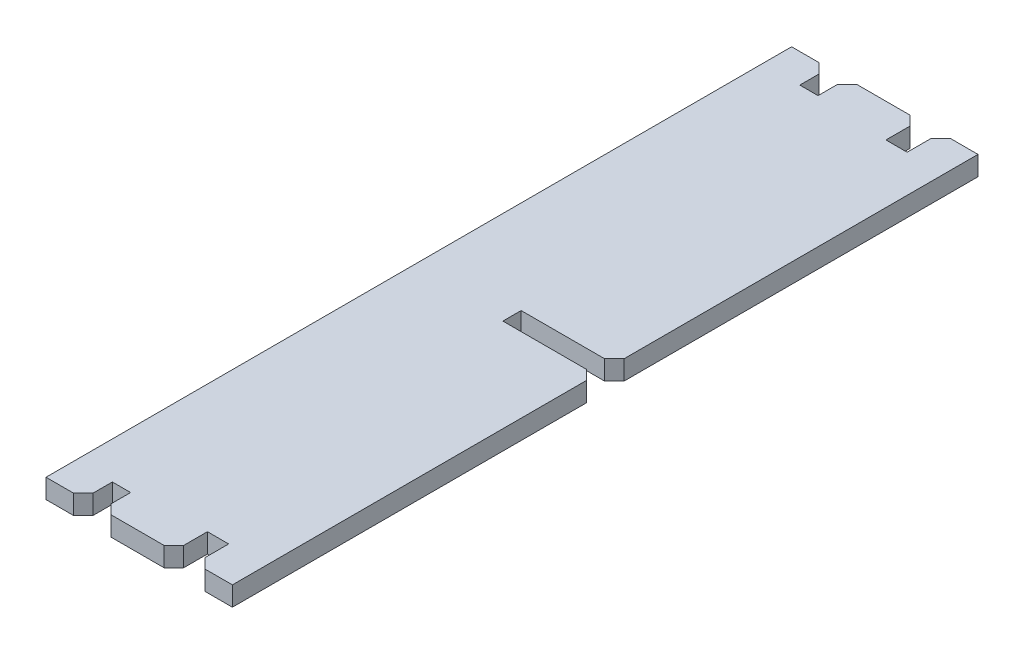
ISO-10303-21;
HEADER;
FILE_DESCRIPTION(('STEP AP214'),'2;1');
FILE_NAME('part.step','',(''),(''),'','','');
FILE_SCHEMA(('AUTOMOTIVE_DESIGN { 1 0 10303 214 1 1 1 1 }'));
ENDSEC;
DATA;
#1=APPLICATION_CONTEXT('core data for automotive mechanical design processes');
#2=APPLICATION_PROTOCOL_DEFINITION('international standard','automotive_design',2000,#1);
#3=PRODUCT_CONTEXT('',#1,'mechanical');
#4=PRODUCT('Part','Part','',(#3));
#5=PRODUCT_RELATED_PRODUCT_CATEGORY('part','',(#4));
#6=PRODUCT_DEFINITION_FORMATION('','',#4);
#7=PRODUCT_DEFINITION_CONTEXT('part definition',#1,'design');
#8=PRODUCT_DEFINITION('design','',#6,#7);
#9=PRODUCT_DEFINITION_SHAPE('','',#8);
#10=(LENGTH_UNIT() NAMED_UNIT(*) SI_UNIT(.MILLI.,.METRE.));
#11=(NAMED_UNIT(*) PLANE_ANGLE_UNIT() SI_UNIT($,.RADIAN.));
#12=(NAMED_UNIT(*) SI_UNIT($,.STERADIAN.) SOLID_ANGLE_UNIT());
#13=UNCERTAINTY_MEASURE_WITH_UNIT(LENGTH_MEASURE(1.E-05),#10,'distance_accuracy_value','');
#14=(GEOMETRIC_REPRESENTATION_CONTEXT(3) GLOBAL_UNCERTAINTY_ASSIGNED_CONTEXT((#13)) GLOBAL_UNIT_ASSIGNED_CONTEXT((#10,
#11,#12)) REPRESENTATION_CONTEXT('',''));
#15=CARTESIAN_POINT('',(0.,0.,0.));
#16=DIRECTION('',(0.,0.,1.));
#17=DIRECTION('',(1.,0.,0.));
#18=AXIS2_PLACEMENT_3D('',#15,#16,#17);
#19=CARTESIAN_POINT('',(0.,5.2,0.));
#20=DIRECTION('',(0.,0.,-1.));
#21=DIRECTION('',(-1.,0.,0.));
#22=AXIS2_PLACEMENT_3D('',#19,#20,#21);
#23=PLANE('',#22);
#24=DIRECTION('',(1.,0.,0.));
#25=VECTOR('',#24,1.);
#26=CARTESIAN_POINT('',(0.,0.,0.));
#27=LINE('',#26,#25);
#28=CARTESIAN_POINT('',(0.,0.,0.));
#29=VERTEX_POINT('',#28);
#30=CARTESIAN_POINT('',(7.40000000000001,0.,0.));
#31=VERTEX_POINT('',#30);
#32=EDGE_CURVE('E398',#29,#31,#27,.T.);
#33=ORIENTED_EDGE('',*,*,#32,.T.);
#34=DIRECTION('',(0.,1.,0.));
#35=VECTOR('',#34,1.);
#36=CARTESIAN_POINT('',(7.40000000000001,5.2,0.));
#37=LINE('',#36,#35);
#38=CARTESIAN_POINT('',(7.40000000000001,5.2,0.));
#39=VERTEX_POINT('',#38);
#40=EDGE_CURVE('E482',#31,#39,#37,.T.);
#41=ORIENTED_EDGE('',*,*,#40,.T.);
#42=DIRECTION('',(1.,0.,0.));
#43=VECTOR('',#42,1.);
#44=CARTESIAN_POINT('',(0.,5.2,0.));
#45=LINE('',#44,#43);
#46=CARTESIAN_POINT('',(0.,5.2,0.));
#47=VERTEX_POINT('',#46);
#48=EDGE_CURVE('E381',#47,#39,#45,.T.);
#49=ORIENTED_EDGE('',*,*,#48,.F.);
#50=DIRECTION('',(0.,-1.,0.));
#51=VECTOR('',#50,1.);
#52=CARTESIAN_POINT('',(0.,5.2,0.));
#53=LINE('',#52,#51);
#54=EDGE_CURVE('E418',#47,#29,#53,.T.);
#55=ORIENTED_EDGE('',*,*,#54,.T.);
#56=EDGE_LOOP('',(#33,#41,#49,#55));
#57=FACE_BOUND('',#56,.T.);
#58=ADVANCED_FACE('F35',(#57),#23,.F.);
#59=CARTESIAN_POINT('',(17.5,0.,0.));
#60=VERTEX_POINT('',#59);
#61=CARTESIAN_POINT('',(31.7,0.,0.));
#62=VERTEX_POINT('',#61);
#63=EDGE_CURVE('E402',#60,#62,#27,.T.);
#64=ORIENTED_EDGE('',*,*,#63,.T.);
#65=DIRECTION('',(0.,1.,0.));
#66=VECTOR('',#65,1.);
#67=CARTESIAN_POINT('',(31.7,5.2,0.));
#68=LINE('',#67,#66);
#69=CARTESIAN_POINT('',(31.7,5.2,0.));
#70=VERTEX_POINT('',#69);
#71=EDGE_CURVE('E472',#62,#70,#68,.T.);
#72=ORIENTED_EDGE('',*,*,#71,.T.);
#73=CARTESIAN_POINT('',(17.5,5.2,0.));
#74=VERTEX_POINT('',#73);
#75=EDGE_CURVE('E385',#74,#70,#45,.T.);
#76=ORIENTED_EDGE('',*,*,#75,.F.);
#77=DIRECTION('',(0.,-1.,0.));
#78=VECTOR('',#77,1.);
#79=CARTESIAN_POINT('',(17.5,5.2,0.));
#80=LINE('',#79,#78);
#81=EDGE_CURVE('E470',#74,#60,#80,.T.);
#82=ORIENTED_EDGE('',*,*,#81,.T.);
#83=EDGE_LOOP('',(#64,#72,#76,#82));
#84=FACE_BOUND('',#83,.T.);
#85=ADVANCED_FACE('F565',(#84),#23,.F.);
#86=CARTESIAN_POINT('',(50.,5.2,0.));
#87=DIRECTION('',(-1.,0.,0.));
#88=DIRECTION('',(0.,0.,1.));
#89=AXIS2_PLACEMENT_3D('',#86,#87,#88);
#90=PLANE('',#89);
#91=DIRECTION('',(0.,0.,-1.));
#92=VECTOR('',#91,1.);
#93=CARTESIAN_POINT('',(50.,0.,0.));
#94=LINE('',#93,#92);
#95=CARTESIAN_POINT('',(50.,0.,0.));
#96=VERTEX_POINT('',#95);
#97=CARTESIAN_POINT('',(50.,0.,-94.95));
#98=VERTEX_POINT('',#97);
#99=EDGE_CURVE('E403',#96,#98,#94,.T.);
#100=ORIENTED_EDGE('',*,*,#99,.T.);
#101=DIRECTION('',(0.,1.,0.));
#102=VECTOR('',#101,1.);
#103=CARTESIAN_POINT('',(50.,5.2,-94.95));
#104=LINE('',#103,#102);
#105=CARTESIAN_POINT('',(50.,5.2,-94.95));
#106=VERTEX_POINT('',#105);
#107=EDGE_CURVE('E490',#98,#106,#104,.T.);
#108=ORIENTED_EDGE('',*,*,#107,.T.);
#109=DIRECTION('',(0.,0.,-1.));
#110=VECTOR('',#109,1.);
#111=CARTESIAN_POINT('',(50.,5.2,0.));
#112=LINE('',#111,#110);
#113=CARTESIAN_POINT('',(50.,5.2,0.));
#114=VERTEX_POINT('',#113);
#115=EDGE_CURVE('E386',#114,#106,#112,.T.);
#116=ORIENTED_EDGE('',*,*,#115,.F.);
#117=DIRECTION('',(0.,-1.,0.));
#118=VECTOR('',#117,1.);
#119=CARTESIAN_POINT('',(50.,5.2,0.));
#120=LINE('',#119,#118);
#121=EDGE_CURVE('E415',#114,#96,#120,.T.);
#122=ORIENTED_EDGE('',*,*,#121,.T.);
#123=EDGE_LOOP('',(#100,#108,#116,#122));
#124=FACE_BOUND('',#123,.T.);
#125=ADVANCED_FACE('F587',(#124),#90,.F.);
#126=CARTESIAN_POINT('',(0.,5.2,-200.));
#127=DIRECTION('',(0.,0.,1.));
#128=DIRECTION('',(1.,0.,0.));
#129=AXIS2_PLACEMENT_3D('',#126,#127,#128);
#130=PLANE('',#129);
#131=DIRECTION('',(-1.,0.,0.));
#132=VECTOR('',#131,1.);
#133=CARTESIAN_POINT('',(0.,5.2,-200.));
#134=LINE('',#133,#132);
#135=CARTESIAN_POINT('',(31.7,5.2,-200.));
#136=VERTEX_POINT('',#135);
#137=CARTESIAN_POINT('',(17.5,5.2,-200.));
#138=VERTEX_POINT('',#137);
#139=EDGE_CURVE('E394',#136,#138,#134,.T.);
#140=ORIENTED_EDGE('',*,*,#139,.F.);
#141=DIRECTION('',(0.,-1.,0.));
#142=VECTOR('',#141,1.);
#143=CARTESIAN_POINT('',(31.7,5.2,-200.));
#144=LINE('',#143,#142);
#145=CARTESIAN_POINT('',(31.7,0.,-200.));
#146=VERTEX_POINT('',#145);
#147=EDGE_CURVE('E446',#136,#146,#144,.T.);
#148=ORIENTED_EDGE('',*,*,#147,.T.);
#149=DIRECTION('',(-1.,0.,0.));
#150=VECTOR('',#149,1.);
#151=CARTESIAN_POINT('',(0.,0.,-200.));
#152=LINE('',#151,#150);
#153=CARTESIAN_POINT('',(17.5,0.,-200.));
#154=VERTEX_POINT('',#153);
#155=EDGE_CURVE('E409',#146,#154,#152,.T.);
#156=ORIENTED_EDGE('',*,*,#155,.T.);
#157=DIRECTION('',(0.,1.,0.));
#158=VECTOR('',#157,1.);
#159=CARTESIAN_POINT('',(17.5,5.2,-200.));
#160=LINE('',#159,#158);
#161=EDGE_CURVE('E443',#154,#138,#160,.T.);
#162=ORIENTED_EDGE('',*,*,#161,.T.);
#163=EDGE_LOOP('',(#140,#148,#156,#162));
#164=FACE_BOUND('',#163,.T.);
#165=ADVANCED_FACE('F535',(#164),#130,.F.);
#166=CARTESIAN_POINT('',(7.39999999999996,5.2,-200.));
#167=VERTEX_POINT('',#166);
#168=CARTESIAN_POINT('',(0.,5.2,-200.));
#169=VERTEX_POINT('',#168);
#170=EDGE_CURVE('E389',#167,#169,#134,.T.);
#171=ORIENTED_EDGE('',*,*,#170,.F.);
#172=DIRECTION('',(0.,-1.,0.));
#173=VECTOR('',#172,1.);
#174=CARTESIAN_POINT('',(7.39999999999996,5.2,-200.));
#175=LINE('',#174,#173);
#176=CARTESIAN_POINT('',(7.39999999999996,0.,-200.));
#177=VERTEX_POINT('',#176);
#178=EDGE_CURVE('E44',#167,#177,#175,.T.);
#179=ORIENTED_EDGE('',*,*,#178,.T.);
#180=CARTESIAN_POINT('',(0.,0.,-200.));
#181=VERTEX_POINT('',#180);
#182=EDGE_CURVE('E406',#177,#181,#152,.T.);
#183=ORIENTED_EDGE('',*,*,#182,.T.);
#184=DIRECTION('',(0.,-1.,0.));
#185=VECTOR('',#184,1.);
#186=CARTESIAN_POINT('',(0.,5.2,-200.));
#187=LINE('',#186,#185);
#188=EDGE_CURVE('E393',#169,#181,#187,.T.);
#189=ORIENTED_EDGE('',*,*,#188,.F.);
#190=EDGE_LOOP('',(#171,#179,#183,#189));
#191=FACE_BOUND('',#190,.T.);
#192=ADVANCED_FACE('F506',(#191),#130,.F.);
#193=CARTESIAN_POINT('',(0.,5.2,0.));
#194=DIRECTION('',(1.,0.,0.));
#195=DIRECTION('',(0.,0.,-1.));
#196=AXIS2_PLACEMENT_3D('',#193,#194,#195);
#197=PLANE('',#196);
#198=DIRECTION('',(0.,0.,1.));
#199=VECTOR('',#198,1.);
#200=CARTESIAN_POINT('',(0.,0.,0.));
#201=LINE('',#200,#199);
#202=EDGE_CURVE('E373',#181,#29,#201,.T.);
#203=ORIENTED_EDGE('',*,*,#202,.T.);
#204=ORIENTED_EDGE('',*,*,#54,.F.);
#205=DIRECTION('',(0.,0.,1.));
#206=VECTOR('',#205,1.);
#207=CARTESIAN_POINT('',(0.,5.2,0.));
#208=LINE('',#207,#206);
#209=EDGE_CURVE('E376',#169,#47,#208,.T.);
#210=ORIENTED_EDGE('',*,*,#209,.F.);
#211=ORIENTED_EDGE('',*,*,#188,.T.);
#212=EDGE_LOOP('',(#203,#204,#210,#211));
#213=FACE_BOUND('',#212,.T.);
#214=ADVANCED_FACE('F540',(#213),#197,.F.);
#215=CARTESIAN_POINT('',(42.6,5.2,0.));
#216=VERTEX_POINT('',#215);
#217=EDGE_CURVE('E379',#216,#114,#45,.T.);
#218=ORIENTED_EDGE('',*,*,#217,.F.);
#219=DIRECTION('',(0.,-1.,0.));
#220=VECTOR('',#219,1.);
#221=CARTESIAN_POINT('',(42.6,5.2,0.));
#222=LINE('',#221,#220);
#223=CARTESIAN_POINT('',(42.6,0.,0.));
#224=VERTEX_POINT('',#223);
#225=EDGE_CURVE('E480',#216,#224,#222,.T.);
#226=ORIENTED_EDGE('',*,*,#225,.T.);
#227=EDGE_CURVE('E397',#224,#96,#27,.T.);
#228=ORIENTED_EDGE('',*,*,#227,.T.);
#229=ORIENTED_EDGE('',*,*,#121,.F.);
#230=EDGE_LOOP('',(#218,#226,#228,#229));
#231=FACE_BOUND('',#230,.T.);
#232=ADVANCED_FACE('F583',(#231),#23,.F.);
#233=CARTESIAN_POINT('',(50.,5.2,-105.05));
#234=VERTEX_POINT('',#233);
#235=CARTESIAN_POINT('',(50.,5.2,-200.));
#236=VERTEX_POINT('',#235);
#237=EDGE_CURVE('E384',#234,#236,#112,.T.);
#238=ORIENTED_EDGE('',*,*,#237,.F.);
#239=DIRECTION('',(0.,-1.,0.));
#240=VECTOR('',#239,1.);
#241=CARTESIAN_POINT('',(50.,5.2,-105.05));
#242=LINE('',#241,#240);
#243=CARTESIAN_POINT('',(50.,0.,-105.05));
#244=VERTEX_POINT('',#243);
#245=EDGE_CURVE('E498',#234,#244,#242,.T.);
#246=ORIENTED_EDGE('',*,*,#245,.T.);
#247=CARTESIAN_POINT('',(50.,0.,-200.));
#248=VERTEX_POINT('',#247);
#249=EDGE_CURVE('E401',#244,#248,#94,.T.);
#250=ORIENTED_EDGE('',*,*,#249,.T.);
#251=DIRECTION('',(0.,-1.,0.));
#252=VECTOR('',#251,1.);
#253=CARTESIAN_POINT('',(50.,5.2,-200.));
#254=LINE('',#253,#252);
#255=EDGE_CURVE('E412',#236,#248,#254,.T.);
#256=ORIENTED_EDGE('',*,*,#255,.F.);
#257=EDGE_LOOP('',(#238,#246,#250,#256));
#258=FACE_BOUND('',#257,.T.);
#259=ADVANCED_FACE('F591',(#258),#90,.F.);
#260=CARTESIAN_POINT('',(42.6,0.,-200.));
#261=VERTEX_POINT('',#260);
#262=EDGE_CURVE('E380',#248,#261,#152,.T.);
#263=ORIENTED_EDGE('',*,*,#262,.T.);
#264=DIRECTION('',(0.,1.,0.));
#265=VECTOR('',#264,1.);
#266=CARTESIAN_POINT('',(42.6,5.2,-200.));
#267=LINE('',#266,#265);
#268=CARTESIAN_POINT('',(42.6,5.2,-200.));
#269=VERTEX_POINT('',#268);
#270=EDGE_CURVE('E465',#261,#269,#267,.T.);
#271=ORIENTED_EDGE('',*,*,#270,.T.);
#272=EDGE_CURVE('E390',#236,#269,#134,.T.);
#273=ORIENTED_EDGE('',*,*,#272,.F.);
#274=ORIENTED_EDGE('',*,*,#255,.T.);
#275=EDGE_LOOP('',(#263,#271,#273,#274));
#276=FACE_BOUND('',#275,.T.);
#277=ADVANCED_FACE('F597',(#276),#130,.F.);
#278=CARTESIAN_POINT('',(0.,5.2,0.));
#279=DIRECTION('',(0.,-1.,0.));
#280=DIRECTION('',(0.,0.,-1.));
#281=AXIS2_PLACEMENT_3D('',#278,#279,#280);
#282=PLANE('',#281);
#283=DIRECTION('',(0.,0.,1.));
#284=VECTOR('',#283,1.);
#285=CARTESIAN_POINT('',(34.3,5.2,-200.));
#286=LINE('',#285,#284);
#287=CARTESIAN_POINT('',(34.3,5.2,-197.4));
#288=VERTEX_POINT('',#287);
#289=CARTESIAN_POINT('',(34.3,5.2,-191.));
#290=VERTEX_POINT('',#289);
#291=EDGE_CURVE('E274',#288,#290,#286,.T.);
#292=ORIENTED_EDGE('',*,*,#291,.F.);
#293=DIRECTION('',(0.707106781186544,0.,0.707106781186551));
#294=VECTOR('',#293,1.);
#295=CARTESIAN_POINT('',(34.3,5.2,-197.4));
#296=LINE('',#295,#294);
#297=EDGE_CURVE('E441',#288,#136,#296,.F.);
#298=ORIENTED_EDGE('',*,*,#297,.T.);
#299=ORIENTED_EDGE('',*,*,#139,.T.);
#300=DIRECTION('',(0.707106781186547,0.,-0.707106781186548));
#301=VECTOR('',#300,1.);
#302=CARTESIAN_POINT('',(17.5,5.2,-200.));
#303=LINE('',#302,#301);
#304=CARTESIAN_POINT('',(14.9,5.2,-197.4));
#305=VERTEX_POINT('',#304);
#306=EDGE_CURVE('E423',#138,#305,#303,.F.);
#307=ORIENTED_EDGE('',*,*,#306,.T.);
#308=DIRECTION('',(0.,0.,-1.));
#309=VECTOR('',#308,1.);
#310=CARTESIAN_POINT('',(14.9,5.2,-200.));
#311=LINE('',#310,#309);
#312=CARTESIAN_POINT('',(14.9,5.2,-192.2));
#313=VERTEX_POINT('',#312);
#314=EDGE_CURVE('E358',#313,#305,#311,.T.);
#315=ORIENTED_EDGE('',*,*,#314,.F.);
#316=DIRECTION('',(1.,0.,0.));
#317=VECTOR('',#316,1.);
#318=CARTESIAN_POINT('',(9.99999999999997,5.2,-192.2));
#319=LINE('',#318,#317);
#320=CARTESIAN_POINT('',(9.99999999999997,5.2,-192.2));
#321=VERTEX_POINT('',#320);
#322=EDGE_CURVE('E366',#321,#313,#319,.T.);
#323=ORIENTED_EDGE('',*,*,#322,.F.);
#324=DIRECTION('',(0.,0.,1.));
#325=VECTOR('',#324,1.);
#326=CARTESIAN_POINT('',(9.99999999999997,5.2,-200.));
#327=LINE('',#326,#325);
#328=CARTESIAN_POINT('',(9.99999999999997,5.2,-197.4));
#329=VERTEX_POINT('',#328);
#330=EDGE_CURVE('E292',#329,#321,#327,.T.);
#331=ORIENTED_EDGE('',*,*,#330,.F.);
#332=DIRECTION('',(0.707106781186548,0.,0.707106781186548));
#333=VECTOR('',#332,1.);
#334=CARTESIAN_POINT('',(9.99999999999997,5.2,-197.4));
#335=LINE('',#334,#333);
#336=EDGE_CURVE('E425',#329,#167,#335,.F.);
#337=ORIENTED_EDGE('',*,*,#336,.T.);
#338=ORIENTED_EDGE('',*,*,#170,.T.);
#339=ORIENTED_EDGE('',*,*,#209,.T.);
#340=ORIENTED_EDGE('',*,*,#48,.T.);
#341=DIRECTION('',(-0.707106781186548,0.,0.707106781186548));
#342=VECTOR('',#341,1.);
#343=CARTESIAN_POINT('',(7.40000000000001,5.2,0.));
#344=LINE('',#343,#342);
#345=CARTESIAN_POINT('',(10.,5.2,-2.59999999999999));
#346=VERTEX_POINT('',#345);
#347=EDGE_CURVE('E433',#39,#346,#344,.F.);
#348=ORIENTED_EDGE('',*,*,#347,.T.);
#349=DIRECTION('',(0.,0.,1.));
#350=VECTOR('',#349,1.);
#351=CARTESIAN_POINT('',(10.,5.2,0.));
#352=LINE('',#351,#350);
#353=CARTESIAN_POINT('',(10.,5.2,-7.8));
#354=VERTEX_POINT('',#353);
#355=EDGE_CURVE('E345',#354,#346,#352,.T.);
#356=ORIENTED_EDGE('',*,*,#355,.F.);
#357=DIRECTION('',(-1.,0.,0.));
#358=VECTOR('',#357,1.);
#359=CARTESIAN_POINT('',(10.,5.2,-7.8));
#360=LINE('',#359,#358);
#361=CARTESIAN_POINT('',(14.9,5.2,-7.8));
#362=VERTEX_POINT('',#361);
#363=EDGE_CURVE('E339',#362,#354,#360,.T.);
#364=ORIENTED_EDGE('',*,*,#363,.F.);
#365=DIRECTION('',(0.,0.,-1.));
#366=VECTOR('',#365,1.);
#367=CARTESIAN_POINT('',(14.9,5.2,0.));
#368=LINE('',#367,#366);
#369=CARTESIAN_POINT('',(14.9,5.2,-2.60000000000002));
#370=VERTEX_POINT('',#369);
#371=EDGE_CURVE('E348',#370,#362,#368,.T.);
#372=ORIENTED_EDGE('',*,*,#371,.F.);
#373=DIRECTION('',(-0.707106781186548,0.,-0.707106781186548));
#374=VECTOR('',#373,1.);
#375=CARTESIAN_POINT('',(14.9,5.2,-2.60000000000002));
#376=LINE('',#375,#374);
#377=EDGE_CURVE('E431',#370,#74,#376,.F.);
#378=ORIENTED_EDGE('',*,*,#377,.T.);
#379=ORIENTED_EDGE('',*,*,#75,.T.);
#380=DIRECTION('',(-0.707106781186548,0.,0.707106781186548));
#381=VECTOR('',#380,1.);
#382=CARTESIAN_POINT('',(31.7,5.2,0.));
#383=LINE('',#382,#381);
#384=CARTESIAN_POINT('',(34.3,5.2,-2.59999999999999));
#385=VERTEX_POINT('',#384);
#386=EDGE_CURVE('E437',#70,#385,#383,.F.);
#387=ORIENTED_EDGE('',*,*,#386,.T.);
#388=DIRECTION('',(0.,0.,1.));
#389=VECTOR('',#388,1.);
#390=CARTESIAN_POINT('',(34.3,5.2,-9.00000000000003));
#391=LINE('',#390,#389);
#392=CARTESIAN_POINT('',(34.3,5.2,-9.00000000000003));
#393=VERTEX_POINT('',#392);
#394=EDGE_CURVE('E324',#393,#385,#391,.T.);
#395=ORIENTED_EDGE('',*,*,#394,.F.);
#396=DIRECTION('',(-1.,0.,0.));
#397=VECTOR('',#396,1.);
#398=CARTESIAN_POINT('',(34.3,5.2,-9.00000000000003));
#399=LINE('',#398,#397);
#400=CARTESIAN_POINT('',(40.,5.2,-9.00000000000003));
#401=VERTEX_POINT('',#400);
#402=EDGE_CURVE('E318',#401,#393,#399,.T.);
#403=ORIENTED_EDGE('',*,*,#402,.F.);
#404=DIRECTION('',(0.,0.,-1.));
#405=VECTOR('',#404,1.);
#406=CARTESIAN_POINT('',(40.,5.2,-9.00000000000003));
#407=LINE('',#406,#405);
#408=CARTESIAN_POINT('',(40.,5.2,-2.59999999999996));
#409=VERTEX_POINT('',#408);
#410=EDGE_CURVE('E327',#409,#401,#407,.T.);
#411=ORIENTED_EDGE('',*,*,#410,.F.);
#412=DIRECTION('',(-0.707106781186551,0.,-0.707106781186544));
#413=VECTOR('',#412,1.);
#414=CARTESIAN_POINT('',(40.,5.2,-2.59999999999996));
#415=LINE('',#414,#413);
#416=EDGE_CURVE('E435',#409,#216,#415,.F.);
#417=ORIENTED_EDGE('',*,*,#416,.T.);
#418=ORIENTED_EDGE('',*,*,#217,.T.);
#419=ORIENTED_EDGE('',*,*,#115,.T.);
#420=DIRECTION('',(0.707106781186551,0.,0.707106781186544));
#421=VECTOR('',#420,1.);
#422=CARTESIAN_POINT('',(50.,5.2,-94.95));
#423=LINE('',#422,#421);
#424=CARTESIAN_POINT('',(47.4,5.2,-97.55));
#425=VERTEX_POINT('',#424);
#426=EDGE_CURVE('E429',#106,#425,#423,.F.);
#427=ORIENTED_EDGE('',*,*,#426,.T.);
#428=DIRECTION('',(1.,0.,0.));
#429=VECTOR('',#428,1.);
#430=CARTESIAN_POINT('',(50.,5.2,-97.55));
#431=LINE('',#430,#429);
#432=CARTESIAN_POINT('',(25.,5.2,-97.55));
#433=VERTEX_POINT('',#432);
#434=EDGE_CURVE('E297',#433,#425,#431,.T.);
#435=ORIENTED_EDGE('',*,*,#434,.F.);
#436=DIRECTION('',(0.,0.,1.));
#437=VECTOR('',#436,1.);
#438=CARTESIAN_POINT('',(25.,5.2,-102.45));
#439=LINE('',#438,#437);
#440=CARTESIAN_POINT('',(25.,5.2,-102.45));
#441=VERTEX_POINT('',#440);
#442=EDGE_CURVE('E306',#441,#433,#439,.T.);
#443=ORIENTED_EDGE('',*,*,#442,.F.);
#444=DIRECTION('',(-1.,0.,0.));
#445=VECTOR('',#444,1.);
#446=CARTESIAN_POINT('',(50.,5.2,-102.45));
#447=LINE('',#446,#445);
#448=CARTESIAN_POINT('',(47.3999999999999,5.2,-102.45));
#449=VERTEX_POINT('',#448);
#450=EDGE_CURVE('E304',#449,#441,#447,.T.);
#451=ORIENTED_EDGE('',*,*,#450,.F.);
#452=DIRECTION('',(-0.707106781186548,0.,0.707106781186548));
#453=VECTOR('',#452,1.);
#454=CARTESIAN_POINT('',(47.3999999999999,5.2,-102.45));
#455=LINE('',#454,#453);
#456=EDGE_CURVE('E427',#449,#234,#455,.F.);
#457=ORIENTED_EDGE('',*,*,#456,.T.);
#458=ORIENTED_EDGE('',*,*,#237,.T.);
#459=ORIENTED_EDGE('',*,*,#272,.T.);
#460=DIRECTION('',(0.707106781186548,0.,-0.707106781186548));
#461=VECTOR('',#460,1.);
#462=CARTESIAN_POINT('',(42.6,5.2,-200.));
#463=LINE('',#462,#461);
#464=CARTESIAN_POINT('',(40.,5.2,-197.4));
#465=VERTEX_POINT('',#464);
#466=EDGE_CURVE('E439',#269,#465,#463,.F.);
#467=ORIENTED_EDGE('',*,*,#466,.T.);
#468=DIRECTION('',(0.,0.,-1.));
#469=VECTOR('',#468,1.);
#470=CARTESIAN_POINT('',(40.,5.2,-200.));
#471=LINE('',#470,#469);
#472=CARTESIAN_POINT('',(40.,5.2,-191.));
#473=VERTEX_POINT('',#472);
#474=EDGE_CURVE('E268',#473,#465,#471,.T.);
#475=ORIENTED_EDGE('',*,*,#474,.F.);
#476=DIRECTION('',(1.,0.,0.));
#477=VECTOR('',#476,1.);
#478=CARTESIAN_POINT('',(34.3,5.2,-191.));
#479=LINE('',#478,#477);
#480=EDGE_CURVE('E287',#290,#473,#479,.T.);
#481=ORIENTED_EDGE('',*,*,#480,.F.);
#482=EDGE_LOOP('',(#292,#298,#299,#307,#315,#323,#331,#337,#338,#339,#340,#348,#356,#364,#372,
#378,#379,#387,#395,#403,#411,#417,#418,#419,#427,#435,#443,#451,#457,#458,#459,#467,#475,#481));
#483=FACE_BOUND('',#482,.T.);
#484=ADVANCED_FACE('F520',(#483),#282,.F.);
#485=CARTESIAN_POINT('',(0.,0.,0.));
#486=DIRECTION('',(0.,-1.,0.));
#487=DIRECTION('',(0.,0.,-1.));
#488=AXIS2_PLACEMENT_3D('',#485,#486,#487);
#489=PLANE('',#488);
#490=ORIENTED_EDGE('',*,*,#155,.F.);
#491=DIRECTION('',(-0.707106781186544,0.,-0.707106781186551));
#492=VECTOR('',#491,1.);
#493=CARTESIAN_POINT('',(115.85,0.,-115.849999999999));
#494=LINE('',#493,#492);
#495=CARTESIAN_POINT('',(34.3,0.,-197.4));
#496=VERTEX_POINT('',#495);
#497=EDGE_CURVE('E264',#146,#496,#494,.F.);
#498=ORIENTED_EDGE('',*,*,#497,.T.);
#499=DIRECTION('',(0.,0.,1.));
#500=VECTOR('',#499,1.);
#501=CARTESIAN_POINT('',(34.3,0.,-200.));
#502=LINE('',#501,#500);
#503=CARTESIAN_POINT('',(34.3,0.,-191.));
#504=VERTEX_POINT('',#503);
#505=EDGE_CURVE('E256',#496,#504,#502,.T.);
#506=ORIENTED_EDGE('',*,*,#505,.T.);
#507=DIRECTION('',(1.,0.,0.));
#508=VECTOR('',#507,1.);
#509=CARTESIAN_POINT('',(34.3,0.,-191.));
#510=LINE('',#509,#508);
#511=CARTESIAN_POINT('',(40.,0.,-191.));
#512=VERTEX_POINT('',#511);
#513=EDGE_CURVE('E262',#504,#512,#510,.T.);
#514=ORIENTED_EDGE('',*,*,#513,.T.);
#515=DIRECTION('',(0.,0.,-1.));
#516=VECTOR('',#515,1.);
#517=CARTESIAN_POINT('',(40.,0.,-200.));
#518=LINE('',#517,#516);
#519=CARTESIAN_POINT('',(40.,0.,-197.4));
#520=VERTEX_POINT('',#519);
#521=EDGE_CURVE('E279',#512,#520,#518,.T.);
#522=ORIENTED_EDGE('',*,*,#521,.T.);
#523=DIRECTION('',(-0.707106781186548,0.,0.707106781186548));
#524=VECTOR('',#523,1.);
#525=CARTESIAN_POINT('',(-78.7,0.,-78.7));
#526=LINE('',#525,#524);
#527=EDGE_CURVE('E462',#520,#261,#526,.F.);
#528=ORIENTED_EDGE('',*,*,#527,.T.);
#529=ORIENTED_EDGE('',*,*,#262,.F.);
#530=ORIENTED_EDGE('',*,*,#249,.F.);
#531=DIRECTION('',(0.707106781186548,0.,-0.707106781186548));
#532=VECTOR('',#531,1.);
#533=CARTESIAN_POINT('',(-27.525,0.,-27.525));
#534=LINE('',#533,#532);
#535=CARTESIAN_POINT('',(47.3999999999999,0.,-102.45));
#536=VERTEX_POINT('',#535);
#537=EDGE_CURVE('E452',#244,#536,#534,.F.);
#538=ORIENTED_EDGE('',*,*,#537,.T.);
#539=DIRECTION('',(-1.,0.,0.));
#540=VECTOR('',#539,1.);
#541=CARTESIAN_POINT('',(50.,0.,-102.45));
#542=LINE('',#541,#540);
#543=CARTESIAN_POINT('',(25.,0.,-102.45));
#544=VERTEX_POINT('',#543);
#545=EDGE_CURVE('E294',#536,#544,#542,.T.);
#546=ORIENTED_EDGE('',*,*,#545,.T.);
#547=DIRECTION('',(0.,0.,1.));
#548=VECTOR('',#547,1.);
#549=CARTESIAN_POINT('',(25.,0.,-102.45));
#550=LINE('',#549,#548);
#551=CARTESIAN_POINT('',(25.,0.,-97.55));
#552=VERTEX_POINT('',#551);
#553=EDGE_CURVE('E296',#544,#552,#550,.T.);
#554=ORIENTED_EDGE('',*,*,#553,.T.);
#555=DIRECTION('',(1.,0.,0.));
#556=VECTOR('',#555,1.);
#557=CARTESIAN_POINT('',(50.,0.,-97.55));
#558=LINE('',#557,#556);
#559=CARTESIAN_POINT('',(47.4,0.,-97.55));
#560=VERTEX_POINT('',#559);
#561=EDGE_CURVE('E300',#552,#560,#558,.T.);
#562=ORIENTED_EDGE('',*,*,#561,.T.);
#563=DIRECTION('',(-0.707106781186551,0.,-0.707106781186544));
#564=VECTOR('',#563,1.);
#565=CARTESIAN_POINT('',(72.4749999999997,0.,-72.4750000000005));
#566=LINE('',#565,#564);
#567=EDGE_CURVE('E454',#560,#98,#566,.F.);
#568=ORIENTED_EDGE('',*,*,#567,.T.);
#569=ORIENTED_EDGE('',*,*,#99,.F.);
#570=ORIENTED_EDGE('',*,*,#227,.F.);
#571=DIRECTION('',(0.707106781186551,0.,0.707106781186544));
#572=VECTOR('',#571,1.);
#573=CARTESIAN_POINT('',(21.2999999999998,0.,-21.3));
#574=LINE('',#573,#572);
#575=CARTESIAN_POINT('',(40.,0.,-2.59999999999996));
#576=VERTEX_POINT('',#575);
#577=EDGE_CURVE('E459',#224,#576,#574,.F.);
#578=ORIENTED_EDGE('',*,*,#577,.T.);
#579=DIRECTION('',(0.,0.,-1.));
#580=VECTOR('',#579,1.);
#581=CARTESIAN_POINT('',(40.,0.,-9.00000000000003));
#582=LINE('',#581,#580);
#583=CARTESIAN_POINT('',(40.,0.,-9.00000000000003));
#584=VERTEX_POINT('',#583);
#585=EDGE_CURVE('E317',#576,#584,#582,.T.);
#586=ORIENTED_EDGE('',*,*,#585,.T.);
#587=DIRECTION('',(-1.,0.,0.));
#588=VECTOR('',#587,1.);
#589=CARTESIAN_POINT('',(34.3,0.,-9.00000000000003));
#590=LINE('',#589,#588);
#591=CARTESIAN_POINT('',(34.3,0.,-9.00000000000003));
#592=VERTEX_POINT('',#591);
#593=EDGE_CURVE('E320',#584,#592,#590,.T.);
#594=ORIENTED_EDGE('',*,*,#593,.T.);
#595=DIRECTION('',(0.,0.,1.));
#596=VECTOR('',#595,1.);
#597=CARTESIAN_POINT('',(34.3,0.,-9.00000000000003));
#598=LINE('',#597,#596);
#599=CARTESIAN_POINT('',(34.3,0.,-2.59999999999999));
#600=VERTEX_POINT('',#599);
#601=EDGE_CURVE('E315',#592,#600,#598,.T.);
#602=ORIENTED_EDGE('',*,*,#601,.T.);
#603=DIRECTION('',(0.707106781186548,0.,-0.707106781186548));
#604=VECTOR('',#603,1.);
#605=CARTESIAN_POINT('',(15.85,0.,15.85));
#606=LINE('',#605,#604);
#607=EDGE_CURVE('E57',#600,#62,#606,.F.);
#608=ORIENTED_EDGE('',*,*,#607,.T.);
#609=ORIENTED_EDGE('',*,*,#63,.F.);
#610=DIRECTION('',(0.707106781186548,0.,0.707106781186548));
#611=VECTOR('',#610,1.);
#612=CARTESIAN_POINT('',(8.75000000000001,0.,-8.75000000000001));
#613=LINE('',#612,#611);
#614=CARTESIAN_POINT('',(14.9,0.,-2.60000000000002));
#615=VERTEX_POINT('',#614);
#616=EDGE_CURVE('E51',#60,#615,#613,.F.);
#617=ORIENTED_EDGE('',*,*,#616,.T.);
#618=DIRECTION('',(0.,0.,-1.));
#619=VECTOR('',#618,1.);
#620=CARTESIAN_POINT('',(14.9,0.,0.));
#621=LINE('',#620,#619);
#622=CARTESIAN_POINT('',(14.9,0.,-7.8));
#623=VERTEX_POINT('',#622);
#624=EDGE_CURVE('E338',#615,#623,#621,.T.);
#625=ORIENTED_EDGE('',*,*,#624,.T.);
#626=DIRECTION('',(-1.,0.,0.));
#627=VECTOR('',#626,1.);
#628=CARTESIAN_POINT('',(10.,0.,-7.8));
#629=LINE('',#628,#627);
#630=CARTESIAN_POINT('',(10.,0.,-7.8));
#631=VERTEX_POINT('',#630);
#632=EDGE_CURVE('E341',#623,#631,#629,.T.);
#633=ORIENTED_EDGE('',*,*,#632,.T.);
#634=DIRECTION('',(0.,0.,1.));
#635=VECTOR('',#634,1.);
#636=CARTESIAN_POINT('',(10.,0.,0.));
#637=LINE('',#636,#635);
#638=CARTESIAN_POINT('',(10.,0.,-2.59999999999999));
#639=VERTEX_POINT('',#638);
#640=EDGE_CURVE('E335',#631,#639,#637,.T.);
#641=ORIENTED_EDGE('',*,*,#640,.T.);
#642=DIRECTION('',(0.707106781186548,0.,-0.707106781186548));
#643=VECTOR('',#642,1.);
#644=CARTESIAN_POINT('',(3.7,0.,3.7));
#645=LINE('',#644,#643);
#646=EDGE_CURVE('E457',#639,#31,#645,.F.);
#647=ORIENTED_EDGE('',*,*,#646,.T.);
#648=ORIENTED_EDGE('',*,*,#32,.F.);
#649=ORIENTED_EDGE('',*,*,#202,.F.);
#650=ORIENTED_EDGE('',*,*,#182,.F.);
#651=DIRECTION('',(-0.707106781186548,0.,-0.707106781186548));
#652=VECTOR('',#651,1.);
#653=CARTESIAN_POINT('',(103.7,0.,-103.7));
#654=LINE('',#653,#652);
#655=CARTESIAN_POINT('',(9.99999999999997,0.,-197.4));
#656=VERTEX_POINT('',#655);
#657=EDGE_CURVE('E450',#177,#656,#654,.F.);
#658=ORIENTED_EDGE('',*,*,#657,.T.);
#659=DIRECTION('',(0.,0.,1.));
#660=VECTOR('',#659,1.);
#661=CARTESIAN_POINT('',(9.99999999999997,0.,-200.));
#662=LINE('',#661,#660);
#663=CARTESIAN_POINT('',(9.99999999999997,0.,-192.2));
#664=VERTEX_POINT('',#663);
#665=EDGE_CURVE('E355',#656,#664,#662,.T.);
#666=ORIENTED_EDGE('',*,*,#665,.T.);
#667=DIRECTION('',(1.,0.,0.));
#668=VECTOR('',#667,1.);
#669=CARTESIAN_POINT('',(9.99999999999997,0.,-192.2));
#670=LINE('',#669,#668);
#671=CARTESIAN_POINT('',(14.9,0.,-192.2));
#672=VERTEX_POINT('',#671);
#673=EDGE_CURVE('E357',#664,#672,#670,.T.);
#674=ORIENTED_EDGE('',*,*,#673,.T.);
#675=DIRECTION('',(0.,0.,-1.));
#676=VECTOR('',#675,1.);
#677=CARTESIAN_POINT('',(14.9,0.,-200.));
#678=LINE('',#677,#676);
#679=CARTESIAN_POINT('',(14.9,0.,-197.4));
#680=VERTEX_POINT('',#679);
#681=EDGE_CURVE('E361',#672,#680,#678,.T.);
#682=ORIENTED_EDGE('',*,*,#681,.T.);
#683=DIRECTION('',(-0.707106781186547,0.,0.707106781186548));
#684=VECTOR('',#683,1.);
#685=CARTESIAN_POINT('',(-91.25,0.,-91.2499999999999));
#686=LINE('',#685,#684);
#687=EDGE_CURVE('E448',#680,#154,#686,.F.);
#688=ORIENTED_EDGE('',*,*,#687,.T.);
#689=EDGE_LOOP('',(#490,#498,#506,#514,#522,#528,#529,#530,#538,#546,#554,#562,#568,#569,#570,
#578,#586,#594,#602,#608,#609,#617,#625,#633,#641,#647,#648,#649,#650,#658,#666,#674,#682,#688));
#690=FACE_BOUND('',#689,.T.);
#691=ADVANCED_FACE('F259',(#690),#489,.T.);
#692=CARTESIAN_POINT('',(9.99999999999997,0.,-200.));
#693=DIRECTION('',(-1.,0.,0.));
#694=DIRECTION('',(0.,0.,1.));
#695=AXIS2_PLACEMENT_3D('',#692,#693,#694);
#696=PLANE('',#695);
#697=ORIENTED_EDGE('',*,*,#665,.F.);
#698=DIRECTION('',(0.,1.,0.));
#699=VECTOR('',#698,1.);
#700=CARTESIAN_POINT('',(9.99999999999997,0.,-197.4));
#701=LINE('',#700,#699);
#702=EDGE_CURVE('E500',#656,#329,#701,.T.);
#703=ORIENTED_EDGE('',*,*,#702,.T.);
#704=ORIENTED_EDGE('',*,*,#330,.T.);
#705=DIRECTION('',(0.,1.,0.));
#706=VECTOR('',#705,1.);
#707=CARTESIAN_POINT('',(9.99999999999997,0.,-192.2));
#708=LINE('',#707,#706);
#709=EDGE_CURVE('E364',#664,#321,#708,.T.);
#710=ORIENTED_EDGE('',*,*,#709,.F.);
#711=EDGE_LOOP('',(#697,#703,#704,#710));
#712=FACE_BOUND('',#711,.T.);
#713=ADVANCED_FACE('F516',(#712),#696,.F.);
#714=CARTESIAN_POINT('',(14.9,0.,-200.));
#715=DIRECTION('',(1.,0.,0.));
#716=DIRECTION('',(0.,0.,-1.));
#717=AXIS2_PLACEMENT_3D('',#714,#715,#716);
#718=PLANE('',#717);
#719=ORIENTED_EDGE('',*,*,#314,.T.);
#720=DIRECTION('',(0.,-1.,0.));
#721=VECTOR('',#720,1.);
#722=CARTESIAN_POINT('',(14.9,0.,-197.4));
#723=LINE('',#722,#721);
#724=EDGE_CURVE('E11',#305,#680,#723,.T.);
#725=ORIENTED_EDGE('',*,*,#724,.T.);
#726=ORIENTED_EDGE('',*,*,#681,.F.);
#727=DIRECTION('',(0.,1.,0.));
#728=VECTOR('',#727,1.);
#729=CARTESIAN_POINT('',(14.9,0.,-192.2));
#730=LINE('',#729,#728);
#731=EDGE_CURVE('E371',#672,#313,#730,.T.);
#732=ORIENTED_EDGE('',*,*,#731,.T.);
#733=EDGE_LOOP('',(#719,#725,#726,#732));
#734=FACE_BOUND('',#733,.T.);
#735=ADVANCED_FACE('F704',(#734),#718,.F.);
#736=CARTESIAN_POINT('',(9.99999999999997,0.,-192.2));
#737=DIRECTION('',(0.,0.,1.));
#738=DIRECTION('',(1.,0.,0.));
#739=AXIS2_PLACEMENT_3D('',#736,#737,#738);
#740=PLANE('',#739);
#741=ORIENTED_EDGE('',*,*,#322,.T.);
#742=ORIENTED_EDGE('',*,*,#731,.F.);
#743=ORIENTED_EDGE('',*,*,#673,.F.);
#744=ORIENTED_EDGE('',*,*,#709,.T.);
#745=EDGE_LOOP('',(#741,#742,#743,#744));
#746=FACE_BOUND('',#745,.T.);
#747=ADVANCED_FACE('F524',(#746),#740,.F.);
#748=CARTESIAN_POINT('',(34.3,0.,-200.));
#749=DIRECTION('',(-1.,0.,0.));
#750=DIRECTION('',(0.,0.,1.));
#751=AXIS2_PLACEMENT_3D('',#748,#749,#750);
#752=PLANE('',#751);
#753=ORIENTED_EDGE('',*,*,#505,.F.);
#754=DIRECTION('',(0.,1.,0.));
#755=VECTOR('',#754,1.);
#756=CARTESIAN_POINT('',(34.3,0.,-197.4));
#757=LINE('',#756,#755);
#758=EDGE_CURVE('E421',#496,#288,#757,.T.);
#759=ORIENTED_EDGE('',*,*,#758,.T.);
#760=ORIENTED_EDGE('',*,*,#291,.T.);
#761=DIRECTION('',(0.,1.,0.));
#762=VECTOR('',#761,1.);
#763=CARTESIAN_POINT('',(34.3,0.,-191.));
#764=LINE('',#763,#762);
#765=EDGE_CURVE('E271',#504,#290,#764,.T.);
#766=ORIENTED_EDGE('',*,*,#765,.F.);
#767=EDGE_LOOP('',(#753,#759,#760,#766));
#768=FACE_BOUND('',#767,.T.);
#769=ADVANCED_FACE('F272',(#768),#752,.F.);
#770=CARTESIAN_POINT('',(40.,0.,-200.));
#771=DIRECTION('',(1.,0.,0.));
#772=DIRECTION('',(0.,0.,-1.));
#773=AXIS2_PLACEMENT_3D('',#770,#771,#772);
#774=PLANE('',#773);
#775=ORIENTED_EDGE('',*,*,#474,.T.);
#776=DIRECTION('',(0.,-1.,0.));
#777=VECTOR('',#776,1.);
#778=CARTESIAN_POINT('',(40.,0.,-197.4));
#779=LINE('',#778,#777);
#780=EDGE_CURVE('E468',#465,#520,#779,.T.);
#781=ORIENTED_EDGE('',*,*,#780,.T.);
#782=ORIENTED_EDGE('',*,*,#521,.F.);
#783=DIRECTION('',(0.,1.,0.));
#784=VECTOR('',#783,1.);
#785=CARTESIAN_POINT('',(40.,0.,-191.));
#786=LINE('',#785,#784);
#787=EDGE_CURVE('E278',#512,#473,#786,.T.);
#788=ORIENTED_EDGE('',*,*,#787,.T.);
#789=EDGE_LOOP('',(#775,#781,#782,#788));
#790=FACE_BOUND('',#789,.T.);
#791=ADVANCED_FACE('F729',(#790),#774,.F.);
#792=CARTESIAN_POINT('',(34.3,0.,-191.));
#793=DIRECTION('',(0.,0.,1.));
#794=DIRECTION('',(1.,0.,0.));
#795=AXIS2_PLACEMENT_3D('',#792,#793,#794);
#796=PLANE('',#795);
#797=ORIENTED_EDGE('',*,*,#480,.T.);
#798=ORIENTED_EDGE('',*,*,#787,.F.);
#799=ORIENTED_EDGE('',*,*,#513,.F.);
#800=ORIENTED_EDGE('',*,*,#765,.T.);
#801=EDGE_LOOP('',(#797,#798,#799,#800));
#802=FACE_BOUND('',#801,.T.);
#803=ADVANCED_FACE('F282',(#802),#796,.F.);
#804=CARTESIAN_POINT('',(50.,0.,-97.55));
#805=DIRECTION('',(0.,0.,1.));
#806=DIRECTION('',(1.,0.,0.));
#807=AXIS2_PLACEMENT_3D('',#804,#805,#806);
#808=PLANE('',#807);
#809=ORIENTED_EDGE('',*,*,#434,.T.);
#810=DIRECTION('',(0.,-1.,0.));
#811=VECTOR('',#810,1.);
#812=CARTESIAN_POINT('',(47.4,0.,-97.55));
#813=LINE('',#812,#811);
#814=EDGE_CURVE('E493',#425,#560,#813,.T.);
#815=ORIENTED_EDGE('',*,*,#814,.T.);
#816=ORIENTED_EDGE('',*,*,#561,.F.);
#817=DIRECTION('',(0.,1.,0.));
#818=VECTOR('',#817,1.);
#819=CARTESIAN_POINT('',(25.,0.,-97.55));
#820=LINE('',#819,#818);
#821=EDGE_CURVE('E288',#552,#433,#820,.T.);
#822=ORIENTED_EDGE('',*,*,#821,.T.);
#823=EDGE_LOOP('',(#809,#815,#816,#822));
#824=FACE_BOUND('',#823,.T.);
#825=ADVANCED_FACE('F685',(#824),#808,.F.);
#826=CARTESIAN_POINT('',(25.,0.,-102.45));
#827=DIRECTION('',(-1.,0.,0.));
#828=DIRECTION('',(0.,0.,1.));
#829=AXIS2_PLACEMENT_3D('',#826,#827,#828);
#830=PLANE('',#829);
#831=ORIENTED_EDGE('',*,*,#442,.T.);
#832=ORIENTED_EDGE('',*,*,#821,.F.);
#833=ORIENTED_EDGE('',*,*,#553,.F.);
#834=DIRECTION('',(0.,1.,0.));
#835=VECTOR('',#834,1.);
#836=CARTESIAN_POINT('',(25.,0.,-102.45));
#837=LINE('',#836,#835);
#838=EDGE_CURVE('E303',#544,#441,#837,.T.);
#839=ORIENTED_EDGE('',*,*,#838,.T.);
#840=EDGE_LOOP('',(#831,#832,#833,#839));
#841=FACE_BOUND('',#840,.T.);
#842=ADVANCED_FACE('F681',(#841),#830,.F.);
#843=CARTESIAN_POINT('',(50.,0.,-102.45));
#844=DIRECTION('',(0.,0.,-1.));
#845=DIRECTION('',(-1.,0.,0.));
#846=AXIS2_PLACEMENT_3D('',#843,#844,#845);
#847=PLANE('',#846);
#848=ORIENTED_EDGE('',*,*,#545,.F.);
#849=DIRECTION('',(0.,1.,0.));
#850=VECTOR('',#849,1.);
#851=CARTESIAN_POINT('',(47.3999999999999,0.,-102.45));
#852=LINE('',#851,#850);
#853=EDGE_CURVE('E495',#536,#449,#852,.T.);
#854=ORIENTED_EDGE('',*,*,#853,.T.);
#855=ORIENTED_EDGE('',*,*,#450,.T.);
#856=ORIENTED_EDGE('',*,*,#838,.F.);
#857=EDGE_LOOP('',(#848,#854,#855,#856));
#858=FACE_BOUND('',#857,.T.);
#859=ADVANCED_FACE('F677',(#858),#847,.F.);
#860=CARTESIAN_POINT('',(34.3,0.,-9.00000000000003));
#861=DIRECTION('',(-1.,0.,0.));
#862=DIRECTION('',(0.,0.,1.));
#863=AXIS2_PLACEMENT_3D('',#860,#861,#862);
#864=PLANE('',#863);
#865=ORIENTED_EDGE('',*,*,#394,.T.);
#866=DIRECTION('',(0.,-1.,0.));
#867=VECTOR('',#866,1.);
#868=CARTESIAN_POINT('',(34.3,0.,-2.59999999999999));
#869=LINE('',#868,#867);
#870=EDGE_CURVE('E475',#385,#600,#869,.T.);
#871=ORIENTED_EDGE('',*,*,#870,.T.);
#872=ORIENTED_EDGE('',*,*,#601,.F.);
#873=DIRECTION('',(0.,1.,0.));
#874=VECTOR('',#873,1.);
#875=CARTESIAN_POINT('',(34.3,0.,-9.00000000000003));
#876=LINE('',#875,#874);
#877=EDGE_CURVE('E307',#592,#393,#876,.T.);
#878=ORIENTED_EDGE('',*,*,#877,.T.);
#879=EDGE_LOOP('',(#865,#871,#872,#878));
#880=FACE_BOUND('',#879,.T.);
#881=ADVANCED_FACE('F620',(#880),#864,.F.);
#882=CARTESIAN_POINT('',(34.3,0.,-9.00000000000003));
#883=DIRECTION('',(0.,0.,-1.));
#884=DIRECTION('',(-1.,0.,0.));
#885=AXIS2_PLACEMENT_3D('',#882,#883,#884);
#886=PLANE('',#885);
#887=ORIENTED_EDGE('',*,*,#402,.T.);
#888=ORIENTED_EDGE('',*,*,#877,.F.);
#889=ORIENTED_EDGE('',*,*,#593,.F.);
#890=DIRECTION('',(0.,1.,0.));
#891=VECTOR('',#890,1.);
#892=CARTESIAN_POINT('',(40.,0.,-9.00000000000003));
#893=LINE('',#892,#891);
#894=EDGE_CURVE('E323',#584,#401,#893,.T.);
#895=ORIENTED_EDGE('',*,*,#894,.T.);
#896=EDGE_LOOP('',(#887,#888,#889,#895));
#897=FACE_BOUND('',#896,.T.);
#898=ADVANCED_FACE('F616',(#897),#886,.F.);
#899=CARTESIAN_POINT('',(40.,0.,-9.00000000000003));
#900=DIRECTION('',(1.,0.,0.));
#901=DIRECTION('',(0.,0.,-1.));
#902=AXIS2_PLACEMENT_3D('',#899,#900,#901);
#903=PLANE('',#902);
#904=ORIENTED_EDGE('',*,*,#585,.F.);
#905=DIRECTION('',(0.,1.,0.));
#906=VECTOR('',#905,1.);
#907=CARTESIAN_POINT('',(40.,0.,-2.59999999999996));
#908=LINE('',#907,#906);
#909=EDGE_CURVE('E477',#576,#409,#908,.T.);
#910=ORIENTED_EDGE('',*,*,#909,.T.);
#911=ORIENTED_EDGE('',*,*,#410,.T.);
#912=ORIENTED_EDGE('',*,*,#894,.F.);
#913=EDGE_LOOP('',(#904,#910,#911,#912));
#914=FACE_BOUND('',#913,.T.);
#915=ADVANCED_FACE('F612',(#914),#903,.F.);
#916=CARTESIAN_POINT('',(10.,0.,0.));
#917=DIRECTION('',(-1.,0.,0.));
#918=DIRECTION('',(0.,0.,1.));
#919=AXIS2_PLACEMENT_3D('',#916,#917,#918);
#920=PLANE('',#919);
#921=ORIENTED_EDGE('',*,*,#355,.T.);
#922=DIRECTION('',(0.,-1.,0.));
#923=VECTOR('',#922,1.);
#924=CARTESIAN_POINT('',(10.,0.,-2.59999999999999));
#925=LINE('',#924,#923);
#926=EDGE_CURVE('E485',#346,#639,#925,.T.);
#927=ORIENTED_EDGE('',*,*,#926,.T.);
#928=ORIENTED_EDGE('',*,*,#640,.F.);
#929=DIRECTION('',(0.,1.,0.));
#930=VECTOR('',#929,1.);
#931=CARTESIAN_POINT('',(10.,0.,-7.8));
#932=LINE('',#931,#930);
#933=EDGE_CURVE('E328',#631,#354,#932,.T.);
#934=ORIENTED_EDGE('',*,*,#933,.T.);
#935=EDGE_LOOP('',(#921,#927,#928,#934));
#936=FACE_BOUND('',#935,.T.);
#937=ADVANCED_FACE('F548',(#936),#920,.F.);
#938=CARTESIAN_POINT('',(10.,0.,-7.8));
#939=DIRECTION('',(0.,0.,-1.));
#940=DIRECTION('',(-1.,0.,0.));
#941=AXIS2_PLACEMENT_3D('',#938,#939,#940);
#942=PLANE('',#941);
#943=ORIENTED_EDGE('',*,*,#363,.T.);
#944=ORIENTED_EDGE('',*,*,#933,.F.);
#945=ORIENTED_EDGE('',*,*,#632,.F.);
#946=DIRECTION('',(0.,1.,0.));
#947=VECTOR('',#946,1.);
#948=CARTESIAN_POINT('',(14.9,0.,-7.8));
#949=LINE('',#948,#947);
#950=EDGE_CURVE('E344',#623,#362,#949,.T.);
#951=ORIENTED_EDGE('',*,*,#950,.T.);
#952=EDGE_LOOP('',(#943,#944,#945,#951));
#953=FACE_BOUND('',#952,.T.);
#954=ADVANCED_FACE('F555',(#953),#942,.F.);
#955=CARTESIAN_POINT('',(14.9,0.,0.));
#956=DIRECTION('',(1.,0.,0.));
#957=DIRECTION('',(0.,0.,-1.));
#958=AXIS2_PLACEMENT_3D('',#955,#956,#957);
#959=PLANE('',#958);
#960=ORIENTED_EDGE('',*,*,#624,.F.);
#961=DIRECTION('',(0.,1.,0.));
#962=VECTOR('',#961,1.);
#963=CARTESIAN_POINT('',(14.9,0.,-2.60000000000002));
#964=LINE('',#963,#962);
#965=EDGE_CURVE('E487',#615,#370,#964,.T.);
#966=ORIENTED_EDGE('',*,*,#965,.T.);
#967=ORIENTED_EDGE('',*,*,#371,.T.);
#968=ORIENTED_EDGE('',*,*,#950,.F.);
#969=EDGE_LOOP('',(#960,#966,#967,#968));
#970=FACE_BOUND('',#969,.T.);
#971=ADVANCED_FACE('F557',(#970),#959,.F.);
#972=CARTESIAN_POINT('',(34.3,0.,-197.4));
#973=DIRECTION('',(-0.707106781186551,0.,0.707106781186544));
#974=DIRECTION('',(0.,1.,0.));
#975=AXIS2_PLACEMENT_3D('',#972,#973,#974);
#976=PLANE('',#975);
#977=ORIENTED_EDGE('',*,*,#497,.F.);
#978=ORIENTED_EDGE('',*,*,#147,.F.);
#979=ORIENTED_EDGE('',*,*,#297,.F.);
#980=ORIENTED_EDGE('',*,*,#758,.F.);
#981=EDGE_LOOP('',(#977,#978,#979,#980));
#982=FACE_BOUND('',#981,.T.);
#983=ADVANCED_FACE('F632',(#982),#976,.F.);
#984=CARTESIAN_POINT('',(42.6,5.2,-200.));
#985=DIRECTION('',(0.707106781186548,0.,0.707106781186548));
#986=DIRECTION('',(0.,1.,0.));
#987=AXIS2_PLACEMENT_3D('',#984,#985,#986);
#988=PLANE('',#987);
#989=ORIENTED_EDGE('',*,*,#527,.F.);
#990=ORIENTED_EDGE('',*,*,#780,.F.);
#991=ORIENTED_EDGE('',*,*,#466,.F.);
#992=ORIENTED_EDGE('',*,*,#270,.F.);
#993=EDGE_LOOP('',(#989,#990,#991,#992));
#994=FACE_BOUND('',#993,.T.);
#995=ADVANCED_FACE('F625',(#994),#988,.F.);
#996=CARTESIAN_POINT('',(31.7,5.2,0.));
#997=DIRECTION('',(-0.707106781186548,0.,-0.707106781186548));
#998=DIRECTION('',(0.,1.,0.));
#999=AXIS2_PLACEMENT_3D('',#996,#997,#998);
#1000=PLANE('',#999);
#1001=ORIENTED_EDGE('',*,*,#607,.F.);
#1002=ORIENTED_EDGE('',*,*,#870,.F.);
#1003=ORIENTED_EDGE('',*,*,#386,.F.);
#1004=ORIENTED_EDGE('',*,*,#71,.F.);
#1005=EDGE_LOOP('',(#1001,#1002,#1003,#1004));
#1006=FACE_BOUND('',#1005,.T.);
#1007=ADVANCED_FACE('F623',(#1006),#1000,.F.);
#1008=CARTESIAN_POINT('',(40.,0.,-2.59999999999996));
#1009=DIRECTION('',(0.707106781186544,0.,-0.707106781186551));
#1010=DIRECTION('',(0.,1.,0.));
#1011=AXIS2_PLACEMENT_3D('',#1008,#1009,#1010);
#1012=PLANE('',#1011);
#1013=ORIENTED_EDGE('',*,*,#577,.F.);
#1014=ORIENTED_EDGE('',*,*,#225,.F.);
#1015=ORIENTED_EDGE('',*,*,#416,.F.);
#1016=ORIENTED_EDGE('',*,*,#909,.F.);
#1017=EDGE_LOOP('',(#1013,#1014,#1015,#1016));
#1018=FACE_BOUND('',#1017,.T.);
#1019=ADVANCED_FACE('F578',(#1018),#1012,.F.);
#1020=CARTESIAN_POINT('',(7.40000000000001,5.2,0.));
#1021=DIRECTION('',(-0.707106781186548,0.,-0.707106781186548));
#1022=DIRECTION('',(0.,1.,0.));
#1023=AXIS2_PLACEMENT_3D('',#1020,#1021,#1022);
#1024=PLANE('',#1023);
#1025=ORIENTED_EDGE('',*,*,#646,.F.);
#1026=ORIENTED_EDGE('',*,*,#926,.F.);
#1027=ORIENTED_EDGE('',*,*,#347,.F.);
#1028=ORIENTED_EDGE('',*,*,#40,.F.);
#1029=EDGE_LOOP('',(#1025,#1026,#1027,#1028));
#1030=FACE_BOUND('',#1029,.T.);
#1031=ADVANCED_FACE('F551',(#1030),#1024,.F.);
#1032=CARTESIAN_POINT('',(14.9,0.,-2.60000000000002));
#1033=DIRECTION('',(0.707106781186548,0.,-0.707106781186548));
#1034=DIRECTION('',(0.,1.,0.));
#1035=AXIS2_PLACEMENT_3D('',#1032,#1033,#1034);
#1036=PLANE('',#1035);
#1037=ORIENTED_EDGE('',*,*,#616,.F.);
#1038=ORIENTED_EDGE('',*,*,#81,.F.);
#1039=ORIENTED_EDGE('',*,*,#377,.F.);
#1040=ORIENTED_EDGE('',*,*,#965,.F.);
#1041=EDGE_LOOP('',(#1037,#1038,#1039,#1040));
#1042=FACE_BOUND('',#1041,.T.);
#1043=ADVANCED_FACE('F567',(#1042),#1036,.F.);
#1044=CARTESIAN_POINT('',(50.,5.2,-94.95));
#1045=DIRECTION('',(-0.707106781186544,0.,0.707106781186551));
#1046=DIRECTION('',(0.,1.,0.));
#1047=AXIS2_PLACEMENT_3D('',#1044,#1045,#1046);
#1048=PLANE('',#1047);
#1049=ORIENTED_EDGE('',*,*,#567,.F.);
#1050=ORIENTED_EDGE('',*,*,#814,.F.);
#1051=ORIENTED_EDGE('',*,*,#426,.F.);
#1052=ORIENTED_EDGE('',*,*,#107,.F.);
#1053=EDGE_LOOP('',(#1049,#1050,#1051,#1052));
#1054=FACE_BOUND('',#1053,.T.);
#1055=ADVANCED_FACE('F569',(#1054),#1048,.F.);
#1056=CARTESIAN_POINT('',(47.3999999999999,0.,-102.45));
#1057=DIRECTION('',(-0.707106781186547,0.,-0.707106781186547));
#1058=DIRECTION('',(0.,1.,0.));
#1059=AXIS2_PLACEMENT_3D('',#1056,#1057,#1058);
#1060=PLANE('',#1059);
#1061=ORIENTED_EDGE('',*,*,#537,.F.);
#1062=ORIENTED_EDGE('',*,*,#245,.F.);
#1063=ORIENTED_EDGE('',*,*,#456,.F.);
#1064=ORIENTED_EDGE('',*,*,#853,.F.);
#1065=EDGE_LOOP('',(#1061,#1062,#1063,#1064));
#1066=FACE_BOUND('',#1065,.T.);
#1067=ADVANCED_FACE('F575',(#1066),#1060,.F.);
#1068=CARTESIAN_POINT('',(9.99999999999997,0.,-197.4));
#1069=DIRECTION('',(-0.707106781186548,0.,0.707106781186548));
#1070=DIRECTION('',(0.,1.,0.));
#1071=AXIS2_PLACEMENT_3D('',#1068,#1069,#1070);
#1072=PLANE('',#1071);
#1073=ORIENTED_EDGE('',*,*,#657,.F.);
#1074=ORIENTED_EDGE('',*,*,#178,.F.);
#1075=ORIENTED_EDGE('',*,*,#336,.F.);
#1076=ORIENTED_EDGE('',*,*,#702,.F.);
#1077=EDGE_LOOP('',(#1073,#1074,#1075,#1076));
#1078=FACE_BOUND('',#1077,.T.);
#1079=ADVANCED_FACE('F513',(#1078),#1072,.F.);
#1080=CARTESIAN_POINT('',(17.5,5.2,-200.));
#1081=DIRECTION('',(0.707106781186548,0.,0.707106781186547));
#1082=DIRECTION('',(0.,1.,0.));
#1083=AXIS2_PLACEMENT_3D('',#1080,#1081,#1082);
#1084=PLANE('',#1083);
#1085=ORIENTED_EDGE('',*,*,#687,.F.);
#1086=ORIENTED_EDGE('',*,*,#724,.F.);
#1087=ORIENTED_EDGE('',*,*,#306,.F.);
#1088=ORIENTED_EDGE('',*,*,#161,.F.);
#1089=EDGE_LOOP('',(#1085,#1086,#1087,#1088));
#1090=FACE_BOUND('',#1089,.T.);
#1091=ADVANCED_FACE('F38',(#1090),#1084,.F.);
#1092=CLOSED_SHELL('',(#58,#85,#125,#165,#192,#214,#232,#259,#277,#484,#691,#713,#735,#747,#769,
#791,#803,#825,#842,#859,#881,#898,#915,#937,#954,#971,#983,#995,#1007,#1019,#1031,#1043,#1055,
#1067,#1079,#1091));
#1093=MANIFOLD_SOLID_BREP('B2',#1092);
#1094=ADVANCED_BREP_SHAPE_REPRESENTATION('',(#18,#1093),#14);
#1095=SHAPE_DEFINITION_REPRESENTATION(#9,#1094);
ENDSEC;
END-ISO-10303-21;
